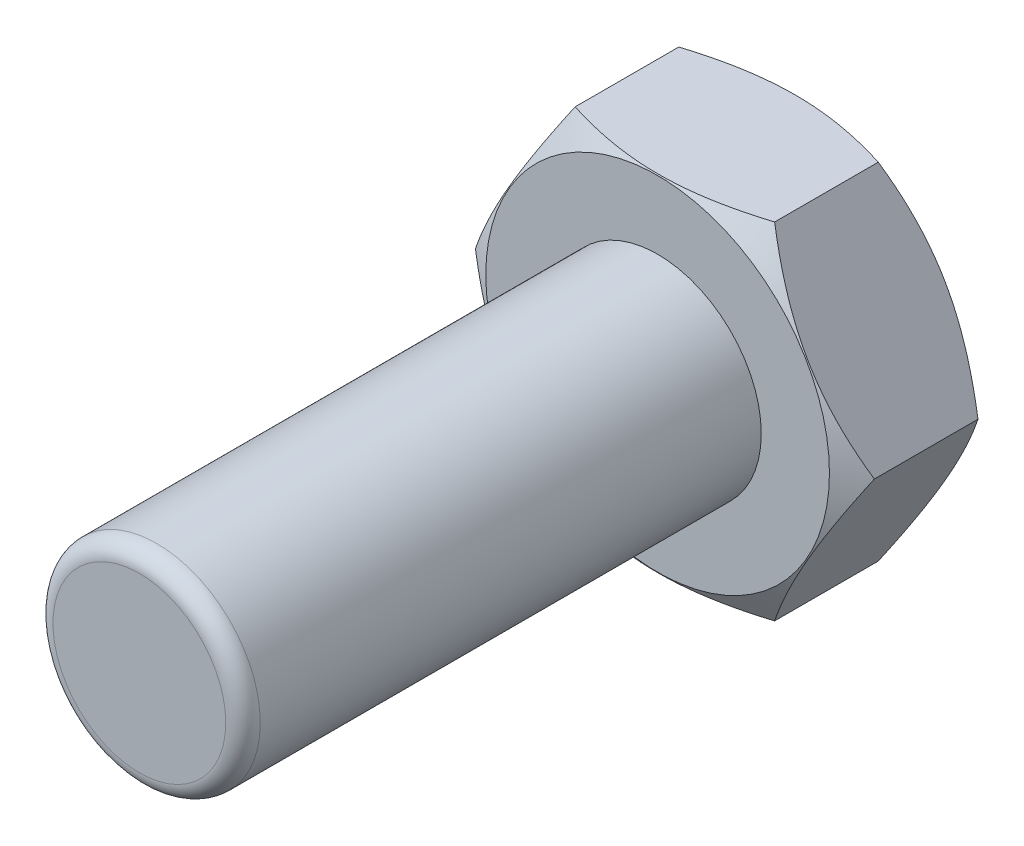
ISO-10303-21;
HEADER;
FILE_DESCRIPTION(('STEP AP214'),'2;1');
FILE_NAME('part.step','',(''),(''),'','','');
FILE_SCHEMA(('AUTOMOTIVE_DESIGN { 1 0 10303 214 1 1 1 1 }'));
ENDSEC;
DATA;
#1=APPLICATION_CONTEXT('core data for automotive mechanical design processes');
#2=APPLICATION_PROTOCOL_DEFINITION('international standard','automotive_design',2000,#1);
#3=PRODUCT_CONTEXT('',#1,'mechanical');
#4=PRODUCT('Part','Part','',(#3));
#5=PRODUCT_RELATED_PRODUCT_CATEGORY('part','',(#4));
#6=PRODUCT_DEFINITION_FORMATION('','',#4);
#7=PRODUCT_DEFINITION_CONTEXT('part definition',#1,'design');
#8=PRODUCT_DEFINITION('design','',#6,#7);
#9=PRODUCT_DEFINITION_SHAPE('','',#8);
#10=(LENGTH_UNIT() NAMED_UNIT(*) SI_UNIT(.MILLI.,.METRE.));
#11=(NAMED_UNIT(*) PLANE_ANGLE_UNIT() SI_UNIT($,.RADIAN.));
#12=(NAMED_UNIT(*) SI_UNIT($,.STERADIAN.) SOLID_ANGLE_UNIT());
#13=UNCERTAINTY_MEASURE_WITH_UNIT(LENGTH_MEASURE(1.E-05),#10,'distance_accuracy_value','');
#14=(GEOMETRIC_REPRESENTATION_CONTEXT(3) GLOBAL_UNCERTAINTY_ASSIGNED_CONTEXT((#13)) GLOBAL_UNIT_ASSIGNED_CONTEXT((#10,
#11,#12)) REPRESENTATION_CONTEXT('',''));
#15=CARTESIAN_POINT('',(0.,0.,0.));
#16=DIRECTION('',(0.,0.,1.));
#17=DIRECTION('',(1.,0.,0.));
#18=AXIS2_PLACEMENT_3D('',#15,#16,#17);
#19=CARTESIAN_POINT('',(0.,0.,4.));
#20=DIRECTION('',(0.,0.,1.));
#21=DIRECTION('',(1.,0.,0.));
#22=AXIS2_PLACEMENT_3D('',#19,#20,#21);
#23=PLANE('',#22);
#24=CARTESIAN_POINT('',(0.,0.,4.));
#25=DIRECTION('',(0.,0.,1.));
#26=DIRECTION('',(1.,0.,0.));
#27=AXIS2_PLACEMENT_3D('',#24,#25,#26);
#28=CIRCLE('',#27,3.);
#29=CARTESIAN_POINT('',(3.,0.,4.));
#30=VERTEX_POINT('',#29);
#31=EDGE_CURVE('E123',#30,#30,#28,.T.);
#32=ORIENTED_EDGE('',*,*,#31,.F.);
#33=EDGE_LOOP('',(#32));
#34=FACE_BOUND('',#33,.T.);
#35=CARTESIAN_POINT('',(0.,0.,4.));
#36=DIRECTION('',(0.,0.,-1.));
#37=DIRECTION('',(-1.,0.,0.));
#38=AXIS2_PLACEMENT_3D('',#35,#36,#37);
#39=CIRCLE('',#38,4.97350269189624);
#40=CARTESIAN_POINT('',(-4.97350269189624,0.,4.));
#41=VERTEX_POINT('',#40);
#42=EDGE_CURVE('E262',#41,#41,#39,.T.);
#43=ORIENTED_EDGE('',*,*,#42,.F.);
#44=EDGE_LOOP('',(#43));
#45=FACE_BOUND('',#44,.T.);
#46=ADVANCED_FACE('F38',(#34,#45),#23,.T.);
#47=CARTESIAN_POINT('',(0.,0.,19.));
#48=DIRECTION('',(0.,0.,-1.));
#49=DIRECTION('',(-1.,0.,0.));
#50=AXIS2_PLACEMENT_3D('',#47,#48,#49);
#51=CYLINDRICAL_SURFACE('',#50,3.);
#52=CARTESIAN_POINT('',(0.,0.,18.5));
#53=DIRECTION('',(0.,0.,1.));
#54=DIRECTION('',(1.,0.,0.));
#55=AXIS2_PLACEMENT_3D('',#52,#53,#54);
#56=CIRCLE('',#55,3.);
#57=CARTESIAN_POINT('',(3.,0.,18.5));
#58=VERTEX_POINT('',#57);
#59=EDGE_CURVE('E11',#58,#58,#56,.F.);
#60=ORIENTED_EDGE('',*,*,#59,.T.);
#61=EDGE_LOOP('',(#60));
#62=FACE_BOUND('',#61,.T.);
#63=ORIENTED_EDGE('',*,*,#31,.T.);
#64=EDGE_LOOP('',(#63));
#65=FACE_BOUND('',#64,.T.);
#66=ADVANCED_FACE('F241',(#62,#65),#51,.T.);
#67=CARTESIAN_POINT('',(0.,0.,19.));
#68=DIRECTION('',(0.,0.,1.));
#69=DIRECTION('',(1.,0.,0.));
#70=AXIS2_PLACEMENT_3D('',#67,#68,#69);
#71=PLANE('',#70);
#72=CARTESIAN_POINT('',(0.,0.,19.));
#73=DIRECTION('',(0.,0.,1.));
#74=DIRECTION('',(1.,0.,0.));
#75=AXIS2_PLACEMENT_3D('',#72,#73,#74);
#76=CIRCLE('',#75,2.5);
#77=CARTESIAN_POINT('',(2.5,0.,19.));
#78=VERTEX_POINT('',#77);
#79=EDGE_CURVE('E46',#78,#78,#76,.T.);
#80=ORIENTED_EDGE('',*,*,#79,.T.);
#81=EDGE_LOOP('',(#80));
#82=FACE_BOUND('',#81,.T.);
#83=ADVANCED_FACE('F171',(#82),#71,.T.);
#84=CARTESIAN_POINT('',(0.,0.,4.));
#85=DIRECTION('',(0.,0.,-1.));
#86=DIRECTION('',(-1.,0.,0.));
#87=AXIS2_PLACEMENT_3D('',#84,#85,#86);
#88=CONICAL_SURFACE('',#87,4.97350269189624,1.01219701145133);
#89=ORIENTED_EDGE('',*,*,#42,.T.);
#90=EDGE_LOOP('',(#89));
#91=FACE_BOUND('',#90,.T.);
#92=CARTESIAN_POINT('',(2.88663587589427,5.00019999999999,3.49992782905133));
#93=CARTESIAN_POINT('',(3.0144081835103,4.7788918714087,3.57983069288711));
#94=CARTESIAN_POINT('',(3.14350838469545,4.55528376368866,3.65255832475134));
#95=CARTESIAN_POINT('',(3.40434625922798,4.10349931246005,3.77942971021988));
#96=CARTESIAN_POINT('',(3.53609053308566,3.87531153653228,3.83351858029309));
#97=CARTESIAN_POINT('',(3.73320124266502,3.53390577282486,3.89654033518077));
#98=CARTESIAN_POINT('',(3.79785381691389,3.42192422938571,3.91438943130841));
#99=CARTESIAN_POINT('',(3.92749478060731,3.19737949352652,3.94417152378572));
#100=CARTESIAN_POINT('',(3.99248313360476,3.0848163642347,3.95610514914306));
#101=CARTESIAN_POINT('',(4.12258249153657,2.85947766626473,3.97372919788761));
#102=CARTESIAN_POINT('',(4.18769319857348,2.74670261356006,3.97942831403867));
#103=CARTESIAN_POINT('',(4.31797052637158,2.52105566273945,3.98446349373414));
#104=CARTESIAN_POINT('',(4.38313714480818,2.40818376864981,3.98379981011161));
#105=CARTESIAN_POINT('',(4.55935821128478,2.10295992814836,3.97338846903841));
#106=CARTESIAN_POINT('',(4.67033513399221,1.91074225955146,3.95755957629237));
#107=CARTESIAN_POINT('',(4.89141814185482,1.52781525724327,3.90854363890215));
#108=CARTESIAN_POINT('',(5.00152313552287,1.33710781404316,3.87533753057274));
#109=CARTESIAN_POINT('',(5.22309732022138,0.953330068499685,3.79277731005549));
#110=CARTESIAN_POINT('',(5.33452908874937,0.760324583831949,3.74303093759897));
#111=CARTESIAN_POINT('',(5.55547623077943,0.377632908048745,3.63053514487105));
#112=CARTESIAN_POINT('',(5.66499546394717,0.187940031796243,3.56781628624835));
#113=CARTESIAN_POINT('',(5.77361816195008,-0.000200000000000483,3.49992782905133));
#114=B_SPLINE_CURVE_WITH_KNOTS('',3,(#92,#93,#94,#95,#96,#97,#98,#99,#100,#101,#102,#103,#104,
#105,#106,#107,#108,#109,#110,#111,#112,#113),.UNSPECIFIED.,.F.,.F.,(4,2,2,2,2,2,2,2,2,2,4),(0.,
0.803762628060273,1.60987217964057,2.00134092758941,2.39276804069575,2.78364868938504,
3.17451380605366,3.84126989592928,4.50875898916442,5.19336506568141,5.87637629561687),.UNSPECIFIED.);
#115=CARTESIAN_POINT('',(2.8867513459481,4.99999999999999,3.5));
#116=VERTEX_POINT('',#115);
#117=CARTESIAN_POINT('',(5.77350269189623,0.,3.5));
#118=VERTEX_POINT('',#117);
#119=EDGE_CURVE('E143',#116,#118,#114,.T.);
#120=ORIENTED_EDGE('',*,*,#119,.F.);
#121=CARTESIAN_POINT('',(-8.68206422951937,4.99999999999995,0.846630360625103));
#122=CARTESIAN_POINT('',(-8.48984229753325,4.99999999999995,0.950725897578673));
#123=CARTESIAN_POINT('',(-8.29726786175632,4.99999999999995,1.0541762232573));
#124=CARTESIAN_POINT('',(-7.91127347550846,4.99999999999995,1.2594985898648));
#125=CARTESIAN_POINT('',(-7.71785350307147,4.99999999999995,1.36137058947439));
#126=CARTESIAN_POINT('',(-7.32973420920898,4.99999999999995,1.56340088051147));
#127=CARTESIAN_POINT('',(-7.13503335969796,4.99999999999996,1.66355624158371));
#128=CARTESIAN_POINT('',(-6.74447923577921,4.99999999999996,1.86160384231195));
#129=CARTESIAN_POINT('',(-6.5486259471362,4.99999999999996,1.95949605393892));
#130=CARTESIAN_POINT('',(-6.14647659846491,4.99999999999996,2.15699563488297));
#131=CARTESIAN_POINT('',(-5.94011649098891,4.99999999999996,2.25647294387211));
#132=CARTESIAN_POINT('',(-5.52564207752674,4.99999999999996,2.4517001259967));
#133=CARTESIAN_POINT('',(-5.31752781829278,4.99999999999996,2.54745009809459));
#134=CARTESIAN_POINT('',(-4.8993416476217,4.99999999999996,2.73423578293052));
#135=CARTESIAN_POINT('',(-4.68927105681938,4.99999999999996,2.82527443739985));
#136=CARTESIAN_POINT('',(-4.26662661952908,4.99999999999997,3.00150319452745));
#137=CARTESIAN_POINT('',(-4.05405221733987,4.99999999999997,3.08669196906337));
#138=CARTESIAN_POINT('',(-3.57313414137315,4.99999999999997,3.26977874676671));
#139=CARTESIAN_POINT('',(-3.30399297837286,4.99999999999997,3.36561353706304));
#140=CARTESIAN_POINT('',(-2.76071897534502,4.99999999999997,3.54168391872462));
#141=CARTESIAN_POINT('',(-2.48658850076106,4.99999999999997,3.621926701917));
#142=CARTESIAN_POINT('',(-1.93783397042628,4.99999999999997,3.76054063429165));
#143=CARTESIAN_POINT('',(-1.66330459966291,4.99999999999997,3.81927389577142));
#144=CARTESIAN_POINT('',(-1.24842593126026,4.99999999999998,3.88858112005756));
#145=CARTESIAN_POINT('',(-1.10962341220006,4.99999999999998,3.90855107983615));
#146=CARTESIAN_POINT('',(-0.831217777316716,4.99999999999998,3.94170090588461));
#147=CARTESIAN_POINT('',(-0.691614784314206,4.99999999999998,3.95488178706191));
#148=CARTESIAN_POINT('',(-0.409902306306351,4.99999999999998,3.97419415083215));
#149=CARTESIAN_POINT('',(-0.267785630771065,4.99999999999998,3.98022161089371));
#150=CARTESIAN_POINT('',(0.0165671641632159,4.99999999999998,3.9846848551111));
#151=CARTESIAN_POINT('',(0.158803282987711,4.99999999999998,3.98312067557459));
#152=CARTESIAN_POINT('',(0.443007126762287,4.99999999999998,3.97244992582317));
#153=CARTESIAN_POINT('',(0.58497482019436,4.99999999999998,3.96334251908101));
#154=CARTESIAN_POINT('',(0.868248164811896,4.99999999999998,3.93788511467705));
#155=CARTESIAN_POINT('',(1.00955380329959,4.99999999999998,3.9215349786746));
#156=CARTESIAN_POINT('',(1.43732445023268,4.99999999999998,3.86157271584852));
#157=CARTESIAN_POINT('',(1.7223245467396,4.99999999999999,3.80727410899935));
#158=CARTESIAN_POINT('',(2.28693891359288,4.99999999999999,3.67599588211175));
#159=CARTESIAN_POINT('',(2.56655131572721,4.99999999999999,3.59900854022744));
#160=CARTESIAN_POINT('',(3.10615883441635,4.99999999999999,3.43228623018333));
#161=CARTESIAN_POINT('',(3.36642379658689,4.99999999999999,3.34340933943089));
#162=CARTESIAN_POINT('',(3.88271763716099,4.99999999999999,3.15402190339427));
#163=CARTESIAN_POINT('',(4.13874526181271,4.99999999999999,3.05350798285101));
#164=CARTESIAN_POINT('',(4.64756504944393,4.99999999999999,2.84360736898123));
#165=CARTESIAN_POINT('',(4.90035165009457,5.,2.73420730846554));
#166=CARTESIAN_POINT('',(5.40291352612095,5.,2.50880985415489));
#167=CARTESIAN_POINT('',(5.65268914184197,5.,2.39281321463871));
#168=CARTESIAN_POINT('',(6.13691988050154,5.,2.16190457091514));
#169=CARTESIAN_POINT('',(6.37149758908357,5.,2.0472484653541));
#170=CARTESIAN_POINT('',(6.83886979381445,5.,1.81434353837331));
#171=CARTESIAN_POINT('',(7.07166421804625,5.,1.69609457300439));
#172=CARTESIAN_POINT('',(7.53476239036371,5.,1.4572651537092));
#173=CARTESIAN_POINT('',(7.76507257776218,5.,1.33669715181897));
#174=CARTESIAN_POINT('',(8.22444085723042,5.00000000000001,1.09326215557268));
#175=CARTESIAN_POINT('',(8.45349909442034,5.00000000000001,0.970395435303213));
#176=CARTESIAN_POINT('',(8.68206422951934,5.00000000000001,0.846630360625105));
#177=B_SPLINE_CURVE_WITH_KNOTS('',3,(#121,#122,#123,#124,#125,#126,#127,#128,#129,#130,#131,
#132,#133,#134,#135,#136,#137,#138,#139,#140,#141,#142,#143,#144,#145,#146,#147,#148,#149,#150,
#151,#152,#153,#154,#155,#156,#157,#158,#159,#160,#161,#162,#163,#164,#165,#166,#167,#168,#169,
#170,#171,#172,#173,#174,#175,#176),.UNSPECIFIED.,.F.,.F.,(4,2,2,2,2,2,2,2,2,2,2,2,2,2,2,2,2,2,
2,2,2,2,2,2,2,2,2,4),(0.,0.655797273333695,1.31161168599699,1.96845209151456,2.62530062762448,
3.31252740730558,3.99973592835045,4.68651004919488,5.37343957919089,6.23016015262012,
7.08648461997409,7.92764658090529,8.34820075809759,8.76869204788465,9.19522584633634,
9.62175760485622,10.0483366711417,10.4749238857053,11.3439958649751,12.213363964989,
13.0380696070739,13.8630150527807,14.6892252790543,15.5153412224169,16.2986012444029,
17.081892689463,17.8617599306687,18.6415347700269),.UNSPECIFIED.);
#178=CARTESIAN_POINT('',(-2.88675134594814,4.99999999999997,3.5));
#179=VERTEX_POINT('',#178);
#180=EDGE_CURVE('E146',#179,#116,#177,.T.);
#181=ORIENTED_EDGE('',*,*,#180,.F.);
#182=CARTESIAN_POINT('',(-5.77361816195007,-0.000200000000040316,3.49992782905133));
#183=CARTESIAN_POINT('',(-5.64584585433404,0.22110812859125,3.57983069288711));
#184=CARTESIAN_POINT('',(-5.5167456531489,0.444716236311288,3.65255832475134));
#185=CARTESIAN_POINT('',(-5.25590777861637,0.896500687539905,3.77942971021988));
#186=CARTESIAN_POINT('',(-5.12416350475869,1.12468846346767,3.83351858029309));
#187=CARTESIAN_POINT('',(-4.92705279517933,1.46609422717509,3.89654033518077));
#188=CARTESIAN_POINT('',(-4.86240022093047,1.57807577061424,3.9143894313084));
#189=CARTESIAN_POINT('',(-4.73275925723705,1.80262050647344,3.94417152378571));
#190=CARTESIAN_POINT('',(-4.66777090423959,1.91518363576525,3.95610514914306));
#191=CARTESIAN_POINT('',(-4.53767154630779,2.14052233373523,3.97372919788761));
#192=CARTESIAN_POINT('',(-4.47256083927088,2.25329738643989,3.97942831403866));
#193=CARTESIAN_POINT('',(-4.34228351147278,2.47894433726051,3.98446349373414));
#194=CARTESIAN_POINT('',(-4.27711689303618,2.59181623135015,3.98379981011161));
#195=CARTESIAN_POINT('',(-4.10089582655958,2.8970400718516,3.97338846903841));
#196=CARTESIAN_POINT('',(-3.98991890385216,3.0892577404485,3.95755957629237));
#197=CARTESIAN_POINT('',(-3.76883589598955,3.4721847427567,3.90854363890215));
#198=CARTESIAN_POINT('',(-3.6587309023215,3.66289218595681,3.87533753057274));
#199=CARTESIAN_POINT('',(-3.43715671762299,4.04666993150028,3.79277731005549));
#200=CARTESIAN_POINT('',(-3.325724949095,4.23967541616802,3.74303093759897));
#201=CARTESIAN_POINT('',(-3.10477780706494,4.62236709195122,3.63053514487105));
#202=CARTESIAN_POINT('',(-2.99525857389721,4.81205996820372,3.56781628624835));
#203=CARTESIAN_POINT('',(-2.8866358758943,5.00019999999997,3.49992782905133));
#204=B_SPLINE_CURVE_WITH_KNOTS('',3,(#182,#183,#184,#185,#186,#187,#188,#189,#190,#191,#192,
#193,#194,#195,#196,#197,#198,#199,#200,#201,#202,#203),.UNSPECIFIED.,.F.,.F.,(4,2,2,2,2,2,2,2,
2,2,4),(0.,0.803762628060273,1.60987217964057,2.0013409275894,2.39276804069575,2.78364868938504,
3.17451380605366,3.84126989592928,4.50875898916442,5.19336506568141,5.87637629561687),.UNSPECIFIED.);
#205=CARTESIAN_POINT('',(-5.77350269189624,0.,3.5));
#206=VERTEX_POINT('',#205);
#207=EDGE_CURVE('E150',#206,#179,#204,.T.);
#208=ORIENTED_EDGE('',*,*,#207,.F.);
#209=CARTESIAN_POINT('',(-2.88663587589423,-5.00020000000001,3.49992782905133));
#210=CARTESIAN_POINT('',(-3.01440818351027,-4.77889187140872,3.57983069288711));
#211=CARTESIAN_POINT('',(-3.14350838469542,-4.55528376368868,3.65255832475134));
#212=CARTESIAN_POINT('',(-3.40434625922795,-4.10349931246007,3.77942971021988));
#213=CARTESIAN_POINT('',(-3.53609053308563,-3.87531153653231,3.83351858029309));
#214=CARTESIAN_POINT('',(-3.733201242665,-3.53390577282489,3.89654033518077));
#215=CARTESIAN_POINT('',(-3.79785381691386,-3.42192422938574,3.9143894313084));
#216=CARTESIAN_POINT('',(-3.92749478060728,-3.19737949352655,3.94417152378571));
#217=CARTESIAN_POINT('',(-3.99248313360474,-3.08481636423473,3.95610514914306));
#218=CARTESIAN_POINT('',(-4.12258249153655,-2.85947766626476,3.97372919788761));
#219=CARTESIAN_POINT('',(-4.18769319857346,-2.74670261356009,3.97942831403866));
#220=CARTESIAN_POINT('',(-4.31797052637156,-2.52105566273948,3.98446349373414));
#221=CARTESIAN_POINT('',(-4.38313714480816,-2.40818376864984,3.98379981011161));
#222=CARTESIAN_POINT('',(-4.55935821128477,-2.10295992814839,3.97338846903841));
#223=CARTESIAN_POINT('',(-4.67033513399219,-1.91074225955149,3.95755957629237));
#224=CARTESIAN_POINT('',(-4.89141814185481,-1.5278152572433,3.90854363890215));
#225=CARTESIAN_POINT('',(-5.00152313552286,-1.33710781404319,3.87533753057274));
#226=CARTESIAN_POINT('',(-5.22309732022137,-0.953330068499722,3.79277731005549));
#227=CARTESIAN_POINT('',(-5.33452908874936,-0.760324583831987,3.74303093759897));
#228=CARTESIAN_POINT('',(-5.55547623077943,-0.377632908048784,3.63053514487105));
#229=CARTESIAN_POINT('',(-5.66499546394717,-0.187940031796282,3.56781628624835));
#230=CARTESIAN_POINT('',(-5.77361816195007,0.000199999999959787,3.49992782905133));
#231=B_SPLINE_CURVE_WITH_KNOTS('',3,(#209,#210,#211,#212,#213,#214,#215,#216,#217,#218,#219,
#220,#221,#222,#223,#224,#225,#226,#227,#228,#229,#230),.UNSPECIFIED.,.F.,.F.,(4,2,2,2,2,2,2,2,
2,2,4),(0.,0.803762628060272,1.60987217964057,2.0013409275894,2.39276804069575,2.78364868938504,
3.17451380605366,3.84126989592928,4.50875898916442,5.19336506568141,5.87637629561687),.UNSPECIFIED.);
#232=CARTESIAN_POINT('',(-2.88675134594807,-5.00000000000001,3.5));
#233=VERTEX_POINT('',#232);
#234=EDGE_CURVE('E53',#233,#206,#231,.T.);
#235=ORIENTED_EDGE('',*,*,#234,.F.);
#236=CARTESIAN_POINT('',(8.6820642295194,-4.99999999999989,0.846630360625105));
#237=CARTESIAN_POINT('',(8.48984229753328,-4.99999999999989,0.950725897578674));
#238=CARTESIAN_POINT('',(8.29726786175635,-4.99999999999989,1.0541762232573));
#239=CARTESIAN_POINT('',(7.9112734755085,-4.9999999999999,1.2594985898648));
#240=CARTESIAN_POINT('',(7.71785350307151,-4.9999999999999,1.36137058947439));
#241=CARTESIAN_POINT('',(7.32973420920902,-4.9999999999999,1.56340088051147));
#242=CARTESIAN_POINT('',(7.135033359698,-4.9999999999999,1.66355624158371));
#243=CARTESIAN_POINT('',(6.74447923577925,-4.99999999999991,1.86160384231195));
#244=CARTESIAN_POINT('',(6.54862594713624,-4.99999999999991,1.95949605393892));
#245=CARTESIAN_POINT('',(6.14647659846495,-4.99999999999991,2.15699563488297));
#246=CARTESIAN_POINT('',(5.94011649098895,-4.99999999999992,2.25647294387211));
#247=CARTESIAN_POINT('',(5.52564207752677,-4.99999999999992,2.4517001259967));
#248=CARTESIAN_POINT('',(5.31752781829282,-4.99999999999992,2.5474500980946));
#249=CARTESIAN_POINT('',(4.89934164762174,-4.99999999999993,2.73423578293052));
#250=CARTESIAN_POINT('',(4.68927105681942,-4.99999999999993,2.82527443739985));
#251=CARTESIAN_POINT('',(4.26662661952912,-4.99999999999993,3.00150319452745));
#252=CARTESIAN_POINT('',(4.05405221733991,-4.99999999999994,3.08669196906338));
#253=CARTESIAN_POINT('',(3.57313414137319,-4.99999999999994,3.26977874676671));
#254=CARTESIAN_POINT('',(3.30399297837289,-4.99999999999994,3.36561353706304));
#255=CARTESIAN_POINT('',(2.76071897534506,-4.99999999999995,3.54168391872462));
#256=CARTESIAN_POINT('',(2.4865885007611,-4.99999999999995,3.621926701917));
#257=CARTESIAN_POINT('',(1.93783397042631,-4.99999999999996,3.76054063429165));
#258=CARTESIAN_POINT('',(1.66330459966295,-4.99999999999996,3.81927389577143));
#259=CARTESIAN_POINT('',(1.2484259312603,-4.99999999999997,3.88858112005756));
#260=CARTESIAN_POINT('',(1.1096234122001,-4.99999999999997,3.90855107983615));
#261=CARTESIAN_POINT('',(0.831217777316753,-4.99999999999997,3.94170090588461));
#262=CARTESIAN_POINT('',(0.691614784314243,-4.99999999999997,3.95488178706191));
#263=CARTESIAN_POINT('',(0.409902306306388,-4.99999999999997,3.97419415083215));
#264=CARTESIAN_POINT('',(0.267785630771101,-4.99999999999998,3.98022161089371));
#265=CARTESIAN_POINT('',(-0.0165671641631801,-4.99999999999998,3.9846848551111));
#266=CARTESIAN_POINT('',(-0.158803282987675,-4.99999999999998,3.98312067557459));
#267=CARTESIAN_POINT('',(-0.443007126762251,-4.99999999999998,3.97244992582318));
#268=CARTESIAN_POINT('',(-0.584974820194325,-4.99999999999998,3.96334251908101));
#269=CARTESIAN_POINT('',(-0.868248164811861,-4.99999999999999,3.93788511467705));
#270=CARTESIAN_POINT('',(-1.00955380329956,-4.99999999999999,3.9215349786746));
#271=CARTESIAN_POINT('',(-1.43732445023265,-4.99999999999999,3.86157271584852));
#272=CARTESIAN_POINT('',(-1.72232454673956,-5.,3.80727410899935));
#273=CARTESIAN_POINT('',(-2.28693891359285,-5.,3.67599588211175));
#274=CARTESIAN_POINT('',(-2.56655131572717,-5.00000000000001,3.59900854022744));
#275=CARTESIAN_POINT('',(-3.10615883441631,-5.00000000000001,3.43228623018333));
#276=CARTESIAN_POINT('',(-3.36642379658686,-5.00000000000001,3.34340933943089));
#277=CARTESIAN_POINT('',(-3.88271763716095,-5.00000000000002,3.15402190339427));
#278=CARTESIAN_POINT('',(-4.13874526181267,-5.00000000000002,3.05350798285101));
#279=CARTESIAN_POINT('',(-4.64756504944389,-5.00000000000003,2.84360736898123));
#280=CARTESIAN_POINT('',(-4.90035165009453,-5.00000000000003,2.73420730846554));
#281=CARTESIAN_POINT('',(-5.40291352612091,-5.00000000000003,2.50880985415489));
#282=CARTESIAN_POINT('',(-5.65268914184193,-5.00000000000004,2.39281321463871));
#283=CARTESIAN_POINT('',(-6.1369198805015,-5.00000000000004,2.16190457091514));
#284=CARTESIAN_POINT('',(-6.37149758908354,-5.00000000000005,2.0472484653541));
#285=CARTESIAN_POINT('',(-6.83886979381441,-5.00000000000005,1.81434353837331));
#286=CARTESIAN_POINT('',(-7.07166421804621,-5.00000000000005,1.69609457300439));
#287=CARTESIAN_POINT('',(-7.53476239036367,-5.00000000000006,1.45726515370919));
#288=CARTESIAN_POINT('',(-7.76507257776214,-5.00000000000006,1.33669715181896));
#289=CARTESIAN_POINT('',(-8.22444085723039,-5.00000000000006,1.09326215557268));
#290=CARTESIAN_POINT('',(-8.45349909442031,-5.00000000000007,0.970395435303211));
#291=CARTESIAN_POINT('',(-8.6820642295193,-5.00000000000007,0.846630360625102));
#292=B_SPLINE_CURVE_WITH_KNOTS('',3,(#236,#237,#238,#239,#240,#241,#242,#243,#244,#245,#246,
#247,#248,#249,#250,#251,#252,#253,#254,#255,#256,#257,#258,#259,#260,#261,#262,#263,#264,#265,
#266,#267,#268,#269,#270,#271,#272,#273,#274,#275,#276,#277,#278,#279,#280,#281,#282,#283,#284,
#285,#286,#287,#288,#289,#290,#291),.UNSPECIFIED.,.F.,.F.,(4,2,2,2,2,2,2,2,2,2,2,2,2,2,2,2,2,2,
2,2,2,2,2,2,2,2,2,4),(0.,0.655797273333695,1.31161168599699,1.96845209151455,2.62530062762447,
3.31252740730558,3.99973592835045,4.68651004919487,5.37343957919089,6.23016015262012,
7.08648461997409,7.92764658090529,8.34820075809759,8.76869204788465,9.19522584633634,
9.62175760485622,10.0483366711417,10.4749238857053,11.3439958649751,12.213363964989,
13.0380696070739,13.8630150527807,14.6892252790543,15.5153412224169,16.2986012444029,
17.081892689463,17.8617599306687,18.6415347700269),.UNSPECIFIED.);
#293=CARTESIAN_POINT('',(2.88675134594817,-4.99999999999995,3.5));
#294=VERTEX_POINT('',#293);
#295=EDGE_CURVE('E178',#294,#233,#292,.T.);
#296=ORIENTED_EDGE('',*,*,#295,.F.);
#297=CARTESIAN_POINT('',(5.77361816195007,0.0002,3.49992782905133));
#298=CARTESIAN_POINT('',(5.64584585433404,-0.221108128591291,3.57983069288711));
#299=CARTESIAN_POINT('',(5.5167456531489,-0.444716236311329,3.65255832475134));
#300=CARTESIAN_POINT('',(5.25590777861637,-0.896500687539947,3.77942971021988));
#301=CARTESIAN_POINT('',(5.12416350475869,-1.12468846346771,3.83351858029309));
#302=CARTESIAN_POINT('',(4.92705279517933,-1.46609422717513,3.89654033518076));
#303=CARTESIAN_POINT('',(4.86240022093047,-1.57807577061428,3.9143894313084));
#304=CARTESIAN_POINT('',(4.73275925723705,-1.80262050647348,3.94417152378571));
#305=CARTESIAN_POINT('',(4.66777090423959,-1.91518363576529,3.95610514914305));
#306=CARTESIAN_POINT('',(4.53767154630779,-2.14052233373527,3.97372919788761));
#307=CARTESIAN_POINT('',(4.47256083927088,-2.25329738643994,3.97942831403866));
#308=CARTESIAN_POINT('',(4.34228351147278,-2.47894433726055,3.98446349373413));
#309=CARTESIAN_POINT('',(4.27711689303618,-2.59181623135019,3.9837998101116));
#310=CARTESIAN_POINT('',(4.10089582655958,-2.89704007185163,3.9733884690384));
#311=CARTESIAN_POINT('',(3.98991890385216,-3.08925774044854,3.95755957629236));
#312=CARTESIAN_POINT('',(3.76883589598956,-3.47218474275672,3.90854363890213));
#313=CARTESIAN_POINT('',(3.65873090232152,-3.66289218595682,3.87533753057273));
#314=CARTESIAN_POINT('',(3.43715671762301,-4.04666993150028,3.79277731005548));
#315=CARTESIAN_POINT('',(3.32572494909503,-4.23967541616802,3.74303093759896));
#316=CARTESIAN_POINT('',(3.10477780706497,-4.62236709195121,3.63053514487104));
#317=CARTESIAN_POINT('',(2.99525857389724,-4.81205996820371,3.56781628624835));
#318=CARTESIAN_POINT('',(2.88663587589434,-5.00019999999995,3.49992782905133));
#319=B_SPLINE_CURVE_WITH_KNOTS('',3,(#297,#298,#299,#300,#301,#302,#303,#304,#305,#306,#307,
#308,#309,#310,#311,#312,#313,#314,#315,#316,#317,#318),.UNSPECIFIED.,.F.,.F.,(4,2,2,2,2,2,2,2,
2,2,4),(0.,0.803762628060273,1.60987217964057,2.0013409275894,2.39276804069575,2.78364868938504,
3.17451380605366,3.84126989592926,4.50875898916438,5.19336506568135,5.87637629561679),.UNSPECIFIED.);
#320=EDGE_CURVE('E132',#118,#294,#319,.T.);
#321=ORIENTED_EDGE('',*,*,#320,.F.);
#322=EDGE_LOOP('',(#120,#181,#208,#235,#296,#321));
#323=FACE_BOUND('',#322,.T.);
#324=ADVANCED_FACE('F165',(#91,#323),#88,.T.);
#325=CARTESIAN_POINT('',(-2.88675134594807,-5.00000000000001,4.));
#326=DIRECTION('',(0.,1.,0.));
#327=DIRECTION('',(-1.,0.,0.));
#328=AXIS2_PLACEMENT_3D('',#325,#326,#327);
#329=PLANE('',#328);
#330=DIRECTION('',(0.,0.,-1.));
#331=VECTOR('',#330,1.);
#332=CARTESIAN_POINT('',(-2.88675134594807,-5.00000000000001,4.));
#333=LINE('',#332,#331);
#334=CARTESIAN_POINT('',(-2.88675134594807,-5.00000000000001,0.500000000000001));
#335=VERTEX_POINT('',#334);
#336=EDGE_CURVE('E111',#233,#335,#333,.T.);
#337=ORIENTED_EDGE('',*,*,#336,.T.);
#338=CARTESIAN_POINT('',(-8.6820642295193,-5.00000000000007,3.1533696393749));
#339=CARTESIAN_POINT('',(-8.48984229753318,-5.00000000000007,3.04927410242133));
#340=CARTESIAN_POINT('',(-8.29726786175625,-5.00000000000006,2.94582377674271));
#341=CARTESIAN_POINT('',(-7.9112734755084,-5.00000000000006,2.7405014101352));
#342=CARTESIAN_POINT('',(-7.71785350307141,-5.00000000000006,2.63862941052562));
#343=CARTESIAN_POINT('',(-7.32973420920891,-5.00000000000006,2.43659911948853));
#344=CARTESIAN_POINT('',(-7.1350333596979,-5.00000000000005,2.3364437584163));
#345=CARTESIAN_POINT('',(-6.74447923577915,-5.00000000000005,2.13839615768806));
#346=CARTESIAN_POINT('',(-6.54862594713614,-5.00000000000005,2.04050394606109));
#347=CARTESIAN_POINT('',(-6.14647659846484,-5.00000000000004,1.84300436511704));
#348=CARTESIAN_POINT('',(-5.94011649098884,-5.00000000000004,1.74352705612789));
#349=CARTESIAN_POINT('',(-5.52564207752667,-5.00000000000004,1.5482998740033));
#350=CARTESIAN_POINT('',(-5.31752781829272,-5.00000000000003,1.45254990190541));
#351=CARTESIAN_POINT('',(-4.89934164762164,-5.00000000000003,1.26576421706949));
#352=CARTESIAN_POINT('',(-4.68927105681932,-5.00000000000003,1.17472556260016));
#353=CARTESIAN_POINT('',(-4.26662661952902,-5.00000000000002,0.998496805472554));
#354=CARTESIAN_POINT('',(-4.05405221733981,-5.00000000000002,0.91330803093663));
#355=CARTESIAN_POINT('',(-3.57313414137309,-5.00000000000002,0.730221253233296));
#356=CARTESIAN_POINT('',(-3.3039929783728,-5.00000000000001,0.634386462936967));
#357=CARTESIAN_POINT('',(-2.76071897534496,-5.00000000000001,0.458316081275384));
#358=CARTESIAN_POINT('',(-2.486588500761,-5.,0.378073298083004));
#359=CARTESIAN_POINT('',(-1.93783397042622,-5.,0.23945936570835));
#360=CARTESIAN_POINT('',(-1.66330459966286,-5.,0.180726104228577));
#361=CARTESIAN_POINT('',(-1.2484259312602,-4.99999999999999,0.111418879942445));
#362=CARTESIAN_POINT('',(-1.1096234122,-4.99999999999999,0.0914489201638492));
#363=CARTESIAN_POINT('',(-0.831217777316658,-4.99999999999999,0.058299094115397));
#364=CARTESIAN_POINT('',(-0.691614784314148,-4.99999999999999,0.0451182129380898));
#365=CARTESIAN_POINT('',(-0.409902306306293,-4.99999999999998,0.025805849167851));
#366=CARTESIAN_POINT('',(-0.267785630771007,-4.99999999999998,0.0197783891062958));
#367=CARTESIAN_POINT('',(0.0165671641632749,-4.99999999999998,0.0153151448889054));
#368=CARTESIAN_POINT('',(0.15880328298777,-4.99999999999998,0.0168793244254143));
#369=CARTESIAN_POINT('',(0.443007126762346,-4.99999999999997,0.027550074176826));
#370=CARTESIAN_POINT('',(0.584974820194419,-4.99999999999997,0.0366574809189879));
#371=CARTESIAN_POINT('',(0.868248164811955,-4.99999999999997,0.0621148853229482));
#372=CARTESIAN_POINT('',(1.00955380329965,-4.99999999999997,0.0784650213254037));
#373=CARTESIAN_POINT('',(1.43732445023274,-4.99999999999996,0.138427284151481));
#374=CARTESIAN_POINT('',(1.72232454673965,-4.99999999999996,0.192725891000653));
#375=CARTESIAN_POINT('',(2.28693891359294,-4.99999999999995,0.324004117888247));
#376=CARTESIAN_POINT('',(2.56655131572726,-4.99999999999995,0.400991459772558));
#377=CARTESIAN_POINT('',(3.10615883441641,-4.99999999999995,0.567713769816669));
#378=CARTESIAN_POINT('',(3.36642379658695,-4.99999999999994,0.65659066056911));
#379=CARTESIAN_POINT('',(3.88271763716105,-4.99999999999994,0.845978096605729));
#380=CARTESIAN_POINT('',(4.13874526181277,-4.99999999999994,0.946492017148991));
#381=CARTESIAN_POINT('',(4.64756504944399,-4.99999999999993,1.15639263101877));
#382=CARTESIAN_POINT('',(4.90035165009463,-4.99999999999993,1.26579269153446));
#383=CARTESIAN_POINT('',(5.40291352612101,-4.99999999999992,1.49119014584511));
#384=CARTESIAN_POINT('',(5.65268914184203,-4.99999999999992,1.60718678536129));
#385=CARTESIAN_POINT('',(6.1369198805016,-4.99999999999991,1.83809542908486));
#386=CARTESIAN_POINT('',(6.37149758908364,-4.99999999999991,1.95275153464591));
#387=CARTESIAN_POINT('',(6.83886979381451,-4.99999999999991,2.18565646162669));
#388=CARTESIAN_POINT('',(7.07166421804631,-4.9999999999999,2.30390542699561));
#389=CARTESIAN_POINT('',(7.53476239036378,-4.9999999999999,2.54273484629081));
#390=CARTESIAN_POINT('',(7.76507257776225,-4.9999999999999,2.66330284818104));
#391=CARTESIAN_POINT('',(8.22444085723049,-4.99999999999989,2.90673784442733));
#392=CARTESIAN_POINT('',(8.45349909442041,-4.99999999999989,3.0296045646968));
#393=CARTESIAN_POINT('',(8.6820642295194,-4.99999999999989,3.1533696393749));
#394=B_SPLINE_CURVE_WITH_KNOTS('',3,(#338,#339,#340,#341,#342,#343,#344,#345,#346,#347,#348,
#349,#350,#351,#352,#353,#354,#355,#356,#357,#358,#359,#360,#361,#362,#363,#364,#365,#366,#367,
#368,#369,#370,#371,#372,#373,#374,#375,#376,#377,#378,#379,#380,#381,#382,#383,#384,#385,#386,
#387,#388,#389,#390,#391,#392,#393),.UNSPECIFIED.,.F.,.F.,(4,2,2,2,2,2,2,2,2,2,2,2,2,2,2,2,2,2,
2,2,2,2,2,2,2,2,2,4),(0.,0.655797273333692,1.31161168599699,1.96845209151456,2.62530062762447,
3.31252740730558,3.99973592835044,4.68651004919487,5.37343957919088,6.23016015262011,
7.08648461997408,7.92764658090528,8.34820075809758,8.76869204788464,9.19522584633633,
9.62175760485622,10.0483366711417,10.4749238857053,11.3439958649751,12.213363964989,
13.0380696070739,13.8630150527807,14.6892252790542,15.5153412224169,16.2986012444029,
17.081892689463,17.8617599306687,18.6415347700269),.UNSPECIFIED.);
#395=CARTESIAN_POINT('',(2.88675134594818,-4.99999999999995,0.500000000000002));
#396=VERTEX_POINT('',#395);
#397=EDGE_CURVE('E94',#335,#396,#394,.T.);
#398=ORIENTED_EDGE('',*,*,#397,.T.);
#399=DIRECTION('',(0.,0.,-1.));
#400=VECTOR('',#399,1.);
#401=CARTESIAN_POINT('',(2.88675134594818,-4.99999999999995,4.));
#402=LINE('',#401,#400);
#403=EDGE_CURVE('E115',#294,#396,#402,.T.);
#404=ORIENTED_EDGE('',*,*,#403,.F.);
#405=ORIENTED_EDGE('',*,*,#295,.T.);
#406=EDGE_LOOP('',(#337,#398,#404,#405));
#407=FACE_BOUND('',#406,.T.);
#408=ADVANCED_FACE('F170',(#407),#329,.F.);
#409=CARTESIAN_POINT('',(-5.77350269189624,0.,4.));
#410=DIRECTION('',(0.866025403784435,0.500000000000007,0.));
#411=DIRECTION('',(-0.500000000000007,0.866025403784435,0.));
#412=AXIS2_PLACEMENT_3D('',#409,#410,#411);
#413=PLANE('',#412);
#414=DIRECTION('',(0.,0.,-1.));
#415=VECTOR('',#414,1.);
#416=CARTESIAN_POINT('',(-5.77350269189624,0.,4.));
#417=LINE('',#416,#415);
#418=CARTESIAN_POINT('',(-5.77350269189624,0.,0.5));
#419=VERTEX_POINT('',#418);
#420=EDGE_CURVE('E105',#206,#419,#417,.T.);
#421=ORIENTED_EDGE('',*,*,#420,.T.);
#422=CARTESIAN_POINT('',(-5.77361816195007,0.00019999999995974,0.500072170948669));
#423=CARTESIAN_POINT('',(-5.64584585433404,-0.221108128591329,0.420169307112892));
#424=CARTESIAN_POINT('',(-5.51674565314889,-0.444716236311365,0.347441675248663));
#425=CARTESIAN_POINT('',(-5.25590777861636,-0.896500687539979,0.220570289780117));
#426=CARTESIAN_POINT('',(-5.12416350475868,-1.12468846346774,0.166481419706909));
#427=CARTESIAN_POINT('',(-4.92705279517931,-1.46609422717516,0.103459664819234));
#428=CARTESIAN_POINT('',(-4.86240022093044,-1.57807577061431,0.0856105686915958));
#429=CARTESIAN_POINT('',(-4.73275925723702,-1.8026205064735,0.055828476214286));
#430=CARTESIAN_POINT('',(-4.66777090423957,-1.91518363576532,0.0438948508569449));
#431=CARTESIAN_POINT('',(-4.53767154630776,-2.14052233373529,0.0262708021123857));
#432=CARTESIAN_POINT('',(-4.47256083927085,-2.25329738643996,0.0205716859613341));
#433=CARTESIAN_POINT('',(-4.34228351147274,-2.47894433726057,0.0155365062658603));
#434=CARTESIAN_POINT('',(-4.27711689303615,-2.59181623135021,0.0162001898883865));
#435=CARTESIAN_POINT('',(-4.10089582655954,-2.89704007185165,0.0266115309615915));
#436=CARTESIAN_POINT('',(-3.98991890385212,-3.08925774044856,0.042440423707629));
#437=CARTESIAN_POINT('',(-3.7688358959895,-3.47218474275675,0.0914563610978547));
#438=CARTESIAN_POINT('',(-3.65873090232145,-3.66289218595686,0.124662469427262));
#439=CARTESIAN_POINT('',(-3.43715671762294,-4.04666993150033,0.207222689944507));
#440=CARTESIAN_POINT('',(-3.32572494909495,-4.23967541616806,0.256969062401031));
#441=CARTESIAN_POINT('',(-3.10477780706488,-4.62236709195126,0.369464855128952));
#442=CARTESIAN_POINT('',(-2.99525857389714,-4.81205996820376,0.432183713751647));
#443=CARTESIAN_POINT('',(-2.88663587589423,-5.00020000000001,0.50007217094867));
#444=B_SPLINE_CURVE_WITH_KNOTS('',3,(#422,#423,#424,#425,#426,#427,#428,#429,#430,#431,#432,
#433,#434,#435,#436,#437,#438,#439,#440,#441,#442,#443),.UNSPECIFIED.,.F.,.F.,(4,2,2,2,2,2,2,2,
2,2,4),(0.,0.803762628060273,1.60987217964057,2.00134092758941,2.39276804069575,
2.78364868938504,3.17451380605366,3.84126989592928,4.50875898916441,5.19336506568141,
5.87637629561687),.UNSPECIFIED.);
#445=EDGE_CURVE('E89',#419,#335,#444,.T.);
#446=ORIENTED_EDGE('',*,*,#445,.T.);
#447=ORIENTED_EDGE('',*,*,#336,.F.);
#448=ORIENTED_EDGE('',*,*,#234,.T.);
#449=EDGE_LOOP('',(#421,#446,#447,#448));
#450=FACE_BOUND('',#449,.T.);
#451=ADVANCED_FACE('F110',(#450),#413,.F.);
#452=CARTESIAN_POINT('',(-2.88675134594814,4.99999999999997,4.));
#453=DIRECTION('',(0.866025403784442,-0.499999999999995,0.));
#454=DIRECTION('',(0.499999999999995,0.866025403784442,0.));
#455=AXIS2_PLACEMENT_3D('',#452,#453,#454);
#456=PLANE('',#455);
#457=DIRECTION('',(0.,0.,-1.));
#458=VECTOR('',#457,1.);
#459=CARTESIAN_POINT('',(-2.88675134594814,4.99999999999997,4.));
#460=LINE('',#459,#458);
#461=CARTESIAN_POINT('',(-2.88675134594814,4.99999999999997,0.500000000000001));
#462=VERTEX_POINT('',#461);
#463=EDGE_CURVE('E107',#179,#462,#460,.T.);
#464=ORIENTED_EDGE('',*,*,#463,.T.);
#465=CARTESIAN_POINT('',(-2.8866358758943,5.00019999999997,0.500072170948671));
#466=CARTESIAN_POINT('',(-3.01440818351034,4.77889187140868,0.420169307112894));
#467=CARTESIAN_POINT('',(-3.14350838469548,4.55528376368864,0.347441675248664));
#468=CARTESIAN_POINT('',(-3.40434625922801,4.10349931246002,0.220570289780117));
#469=CARTESIAN_POINT('',(-3.53609053308568,3.87531153653226,0.166481419706909));
#470=CARTESIAN_POINT('',(-3.73320124266505,3.53390577282484,0.103459664819235));
#471=CARTESIAN_POINT('',(-3.79785381691391,3.42192422938569,0.0856105686915962));
#472=CARTESIAN_POINT('',(-3.92749478060733,3.19737949352649,0.0558284762142863));
#473=CARTESIAN_POINT('',(-3.99248313360478,3.08481636423468,0.0438948508569451));
#474=CARTESIAN_POINT('',(-4.12258249153659,2.8594776662647,0.0262708021123858));
#475=CARTESIAN_POINT('',(-4.1876931985735,2.74670261356003,0.0205716859613343));
#476=CARTESIAN_POINT('',(-4.3179705263716,2.52105566273942,0.0155365062658602));
#477=CARTESIAN_POINT('',(-4.38313714480819,2.40818376864978,0.016200189888386));
#478=CARTESIAN_POINT('',(-4.5593582112848,2.10295992814833,0.0266115309615907));
#479=CARTESIAN_POINT('',(-4.67033513399222,1.91074225955142,0.042440423707629));
#480=CARTESIAN_POINT('',(-4.89141814185483,1.52781525724323,0.0914563610978549));
#481=CARTESIAN_POINT('',(-5.00152313552288,1.33710781404312,0.124662469427261));
#482=CARTESIAN_POINT('',(-5.22309732022138,0.953330068499648,0.207222689944506));
#483=CARTESIAN_POINT('',(-5.33452908874937,0.760324583831911,0.25696906240103));
#484=CARTESIAN_POINT('',(-5.55547623077943,0.377632908048706,0.369464855128951));
#485=CARTESIAN_POINT('',(-5.66499546394717,0.187940031796203,0.432183713751646));
#486=CARTESIAN_POINT('',(-5.77361816195007,-0.000200000000040686,0.500072170948669));
#487=B_SPLINE_CURVE_WITH_KNOTS('',3,(#465,#466,#467,#468,#469,#470,#471,#472,#473,#474,#475,
#476,#477,#478,#479,#480,#481,#482,#483,#484,#485,#486),.UNSPECIFIED.,.F.,.F.,(4,2,2,2,2,2,2,2,
2,2,4),(0.,0.803762628060274,1.60987217964057,2.00134092758941,2.39276804069575,
2.78364868938504,3.17451380605366,3.84126989592928,4.50875898916442,5.19336506568141,
5.87637629561687),.UNSPECIFIED.);
#488=EDGE_CURVE('E92',#462,#419,#487,.T.);
#489=ORIENTED_EDGE('',*,*,#488,.T.);
#490=ORIENTED_EDGE('',*,*,#420,.F.);
#491=ORIENTED_EDGE('',*,*,#207,.T.);
#492=EDGE_LOOP('',(#464,#489,#490,#491));
#493=FACE_BOUND('',#492,.T.);
#494=ADVANCED_FACE('F103',(#493),#456,.F.);
#495=CARTESIAN_POINT('',(2.88675134594811,4.99999999999999,4.));
#496=DIRECTION('',(0.,-1.,0.));
#497=DIRECTION('',(1.,0.,0.));
#498=AXIS2_PLACEMENT_3D('',#495,#496,#497);
#499=PLANE('',#498);
#500=DIRECTION('',(0.,0.,-1.));
#501=VECTOR('',#500,1.);
#502=CARTESIAN_POINT('',(2.88675134594811,4.99999999999999,4.));
#503=LINE('',#502,#501);
#504=CARTESIAN_POINT('',(2.8867513459481,4.99999999999999,0.500000000000002));
#505=VERTEX_POINT('',#504);
#506=EDGE_CURVE('E113',#116,#505,#503,.T.);
#507=ORIENTED_EDGE('',*,*,#506,.T.);
#508=CARTESIAN_POINT('',(8.68206422951934,5.00000000000001,3.1533696393749));
#509=CARTESIAN_POINT('',(8.48984229753322,5.00000000000001,3.04927410242133));
#510=CARTESIAN_POINT('',(8.29726786175629,5.00000000000001,2.94582377674271));
#511=CARTESIAN_POINT('',(7.91127347550843,5.00000000000001,2.74050141013521));
#512=CARTESIAN_POINT('',(7.71785350307144,5.00000000000001,2.63862941052562));
#513=CARTESIAN_POINT('',(7.32973420920895,5.,2.43659911948854));
#514=CARTESIAN_POINT('',(7.13503335969793,5.,2.3364437584163));
#515=CARTESIAN_POINT('',(6.74447923577918,5.,2.13839615768806));
#516=CARTESIAN_POINT('',(6.54862594713617,5.,2.04050394606109));
#517=CARTESIAN_POINT('',(6.14647659846488,5.,1.84300436511704));
#518=CARTESIAN_POINT('',(5.94011649098888,5.,1.7435270561279));
#519=CARTESIAN_POINT('',(5.52564207752671,5.,1.5482998740033));
#520=CARTESIAN_POINT('',(5.31752781829276,5.,1.45254990190541));
#521=CARTESIAN_POINT('',(4.89934164762167,4.99999999999999,1.26576421706949));
#522=CARTESIAN_POINT('',(4.68927105681936,4.99999999999999,1.17472556260016));
#523=CARTESIAN_POINT('',(4.26662661952905,4.99999999999999,0.998496805472556));
#524=CARTESIAN_POINT('',(4.05405221733984,4.99999999999999,0.913308030936631));
#525=CARTESIAN_POINT('',(3.57313414137313,4.99999999999999,0.730221253233297));
#526=CARTESIAN_POINT('',(3.30399297837283,4.99999999999999,0.634386462936969));
#527=CARTESIAN_POINT('',(2.760718975345,4.99999999999999,0.458316081275384));
#528=CARTESIAN_POINT('',(2.48658850076103,4.99999999999999,0.378073298083004));
#529=CARTESIAN_POINT('',(1.93783397042625,4.99999999999999,0.23945936570835));
#530=CARTESIAN_POINT('',(1.66330459966289,4.99999999999998,0.180726104228578));
#531=CARTESIAN_POINT('',(1.24842593126024,4.99999999999998,0.111418879942445));
#532=CARTESIAN_POINT('',(1.10962341220004,4.99999999999998,0.0914489201638491));
#533=CARTESIAN_POINT('',(0.831217777316691,4.99999999999998,0.0582990941153968));
#534=CARTESIAN_POINT('',(0.691614784314181,4.99999999999998,0.0451182129380904));
#535=CARTESIAN_POINT('',(0.409902306306325,4.99999999999998,0.0258058491678521));
#536=CARTESIAN_POINT('',(0.267785630771039,4.99999999999998,0.0197783891062967));
#537=CARTESIAN_POINT('',(-0.0165671641632423,4.99999999999998,0.0153151448889057));
#538=CARTESIAN_POINT('',(-0.158803282987737,4.99999999999998,0.0168793244254144));
#539=CARTESIAN_POINT('',(-0.443007126762313,4.99999999999998,0.0275500741768264));
#540=CARTESIAN_POINT('',(-0.584974820194386,4.99999999999998,0.0366574809189886));
#541=CARTESIAN_POINT('',(-0.868248164811923,4.99999999999998,0.0621148853229491));
#542=CARTESIAN_POINT('',(-1.00955380329962,4.99999999999998,0.0784650213254042));
#543=CARTESIAN_POINT('',(-1.43732445023271,4.99999999999998,0.138427284151481));
#544=CARTESIAN_POINT('',(-1.72232454673962,4.99999999999997,0.192725891000653));
#545=CARTESIAN_POINT('',(-2.28693891359291,4.99999999999997,0.324004117888247));
#546=CARTESIAN_POINT('',(-2.56655131572723,4.99999999999997,0.400991459772558));
#547=CARTESIAN_POINT('',(-3.10615883441638,4.99999999999997,0.567713769816669));
#548=CARTESIAN_POINT('',(-3.36642379658692,4.99999999999997,0.65659066056911));
#549=CARTESIAN_POINT('',(-3.88271763716101,4.99999999999997,0.845978096605729));
#550=CARTESIAN_POINT('',(-4.13874526181274,4.99999999999997,0.94649201714899));
#551=CARTESIAN_POINT('',(-4.64756504944395,4.99999999999996,1.15639263101877));
#552=CARTESIAN_POINT('',(-4.9003516500946,4.99999999999996,1.26579269153446));
#553=CARTESIAN_POINT('',(-5.40291352612097,4.99999999999996,1.49119014584511));
#554=CARTESIAN_POINT('',(-5.65268914184199,4.99999999999996,1.60718678536129));
#555=CARTESIAN_POINT('',(-6.13691988050156,4.99999999999996,1.83809542908486));
#556=CARTESIAN_POINT('',(-6.3714975890836,4.99999999999996,1.9527515346459));
#557=CARTESIAN_POINT('',(-6.83886979381447,4.99999999999996,2.18565646162669));
#558=CARTESIAN_POINT('',(-7.07166421804627,4.99999999999996,2.30390542699561));
#559=CARTESIAN_POINT('',(-7.53476239036374,4.99999999999995,2.54273484629081));
#560=CARTESIAN_POINT('',(-7.76507257776221,4.99999999999995,2.66330284818104));
#561=CARTESIAN_POINT('',(-8.22444085723045,4.99999999999995,2.90673784442732));
#562=CARTESIAN_POINT('',(-8.45349909442038,4.99999999999995,3.02960456469679));
#563=CARTESIAN_POINT('',(-8.68206422951937,4.99999999999995,3.1533696393749));
#564=B_SPLINE_CURVE_WITH_KNOTS('',3,(#508,#509,#510,#511,#512,#513,#514,#515,#516,#517,#518,
#519,#520,#521,#522,#523,#524,#525,#526,#527,#528,#529,#530,#531,#532,#533,#534,#535,#536,#537,
#538,#539,#540,#541,#542,#543,#544,#545,#546,#547,#548,#549,#550,#551,#552,#553,#554,#555,#556,
#557,#558,#559,#560,#561,#562,#563),.UNSPECIFIED.,.F.,.F.,(4,2,2,2,2,2,2,2,2,2,2,2,2,2,2,2,2,2,
2,2,2,2,2,2,2,2,2,4),(0.,0.655797273333693,1.31161168599699,1.96845209151455,2.62530062762447,
3.31252740730558,3.99973592835044,4.68651004919487,5.37343957919088,6.23016015262011,
7.08648461997409,7.92764658090529,8.34820075809758,8.76869204788465,9.19522584633634,
9.62175760485622,10.0483366711417,10.4749238857053,11.3439958649751,12.213363964989,
13.0380696070739,13.8630150527807,14.6892252790542,15.5153412224169,16.2986012444029,
17.081892689463,17.8617599306687,18.6415347700269),.UNSPECIFIED.);
#565=EDGE_CURVE('E108',#505,#462,#564,.T.);
#566=ORIENTED_EDGE('',*,*,#565,.T.);
#567=ORIENTED_EDGE('',*,*,#463,.F.);
#568=ORIENTED_EDGE('',*,*,#180,.T.);
#569=EDGE_LOOP('',(#507,#566,#567,#568));
#570=FACE_BOUND('',#569,.T.);
#571=ADVANCED_FACE('F201',(#570),#499,.F.);
#572=CARTESIAN_POINT('',(5.77350269189624,0.,4.));
#573=DIRECTION('',(-0.866025403784438,-0.500000000000001,0.));
#574=DIRECTION('',(0.500000000000001,-0.866025403784438,0.));
#575=AXIS2_PLACEMENT_3D('',#572,#573,#574);
#576=PLANE('',#575);
#577=DIRECTION('',(0.,0.,-1.));
#578=VECTOR('',#577,1.);
#579=CARTESIAN_POINT('',(5.77350269189624,0.,4.));
#580=LINE('',#579,#578);
#581=CARTESIAN_POINT('',(5.77350269189624,0.,0.500000000000003));
#582=VERTEX_POINT('',#581);
#583=EDGE_CURVE('E121',#118,#582,#580,.T.);
#584=ORIENTED_EDGE('',*,*,#583,.T.);
#585=CARTESIAN_POINT('',(5.77361816195008,-0.000200000000000055,0.500072170948672));
#586=CARTESIAN_POINT('',(5.64584585433404,0.221108128591289,0.420169307112895));
#587=CARTESIAN_POINT('',(5.5167456531489,0.444716236311327,0.347441675248666));
#588=CARTESIAN_POINT('',(5.25590777861637,0.896500687539943,0.22057028978012));
#589=CARTESIAN_POINT('',(5.12416350475869,1.12468846346771,0.166481419706912));
#590=CARTESIAN_POINT('',(4.92705279517932,1.46609422717512,0.103459664819237));
#591=CARTESIAN_POINT('',(4.86240022093046,1.57807577061428,0.0856105686915979));
#592=CARTESIAN_POINT('',(4.73275925723704,1.80262050647347,0.0558284762142881));
#593=CARTESIAN_POINT('',(4.66777090423958,1.91518363576529,0.0438948508569472));
#594=CARTESIAN_POINT('',(4.53767154630778,2.14052233373526,0.026270802112388));
#595=CARTESIAN_POINT('',(4.47256083927086,2.25329738643993,0.0205716859613363));
#596=CARTESIAN_POINT('',(4.34228351147276,2.47894433726054,0.0155365062658623));
#597=CARTESIAN_POINT('',(4.27711689303617,2.59181623135018,0.0162001898883885));
#598=CARTESIAN_POINT('',(4.10089582655956,2.89704007185163,0.0266115309615936));
#599=CARTESIAN_POINT('',(3.98991890385214,3.08925774044853,0.0424404237076316));
#600=CARTESIAN_POINT('',(3.76883589598953,3.47218474275672,0.0914563610978571));
#601=CARTESIAN_POINT('',(3.65873090232148,3.66289218595683,0.124662469427264));
#602=CARTESIAN_POINT('',(3.43715671762297,4.0466699315003,0.207222689944509));
#603=CARTESIAN_POINT('',(3.32572494909497,4.23967541616804,0.256969062401032));
#604=CARTESIAN_POINT('',(3.10477780706491,4.62236709195124,0.369464855128954));
#605=CARTESIAN_POINT('',(2.99525857389718,4.81205996820375,0.432183713751649));
#606=CARTESIAN_POINT('',(2.88663587589427,5.00019999999999,0.500072170948671));
#607=B_SPLINE_CURVE_WITH_KNOTS('',3,(#585,#586,#587,#588,#589,#590,#591,#592,#593,#594,#595,
#596,#597,#598,#599,#600,#601,#602,#603,#604,#605,#606),.UNSPECIFIED.,.F.,.F.,(4,2,2,2,2,2,2,2,
2,2,4),(0.,0.803762628060274,1.60987217964057,2.00134092758941,2.39276804069575,
2.78364868938504,3.17451380605366,3.84126989592928,4.50875898916442,5.19336506568141,
5.87637629561687),.UNSPECIFIED.);
#608=EDGE_CURVE('E220',#582,#505,#607,.T.);
#609=ORIENTED_EDGE('',*,*,#608,.T.);
#610=ORIENTED_EDGE('',*,*,#506,.F.);
#611=ORIENTED_EDGE('',*,*,#119,.T.);
#612=EDGE_LOOP('',(#584,#609,#610,#611));
#613=FACE_BOUND('',#612,.T.);
#614=ADVANCED_FACE('F163',(#613),#576,.F.);
#615=CARTESIAN_POINT('',(2.88675134594818,-4.99999999999995,4.));
#616=DIRECTION('',(-0.866025403784442,0.499999999999995,0.));
#617=DIRECTION('',(-0.499999999999995,-0.866025403784442,0.));
#618=AXIS2_PLACEMENT_3D('',#615,#616,#617);
#619=PLANE('',#618);
#620=ORIENTED_EDGE('',*,*,#403,.T.);
#621=CARTESIAN_POINT('',(2.88663587589434,-5.00019999999995,0.500072170948671));
#622=CARTESIAN_POINT('',(3.01440818351037,-4.77889187140866,0.420169307112894));
#623=CARTESIAN_POINT('',(3.14350838469552,-4.55528376368862,0.347441675248666));
#624=CARTESIAN_POINT('',(3.40434625922804,-4.10349931246,0.220570289780123));
#625=CARTESIAN_POINT('',(3.53609053308572,-3.87531153653223,0.166481419706916));
#626=CARTESIAN_POINT('',(3.73320124266508,-3.53390577282482,0.103459664819243));
#627=CARTESIAN_POINT('',(3.79785381691395,-3.42192422938566,0.085610568691605));
#628=CARTESIAN_POINT('',(3.92749478060737,-3.19737949352647,0.0558284762142964));
#629=CARTESIAN_POINT('',(3.99248313360482,-3.08481636423465,0.0438948508569562));
#630=CARTESIAN_POINT('',(4.12258249153663,-2.85947766626468,0.0262708021123982));
#631=CARTESIAN_POINT('',(4.18769319857354,-2.74670261356001,0.020571685961347));
#632=CARTESIAN_POINT('',(4.31797052637164,-2.52105566273939,0.0155365062658745));
#633=CARTESIAN_POINT('',(4.38313714480823,-2.40818376864976,0.0162001898884016));
#634=CARTESIAN_POINT('',(4.55935821128483,-2.10295992814831,0.0266115309616084));
#635=CARTESIAN_POINT('',(4.67033513399225,-1.91074225955141,0.0424404237076459));
#636=CARTESIAN_POINT('',(4.89141814185485,-1.52781525724323,0.0914563610978709));
#637=CARTESIAN_POINT('',(5.0015231355229,-1.33710781404312,0.124662469427277));
#638=CARTESIAN_POINT('',(5.2230973202214,-0.953330068499663,0.20722268994452));
#639=CARTESIAN_POINT('',(5.33452908874939,-0.760324583831932,0.256969062401041));
#640=CARTESIAN_POINT('',(5.55547623077944,-0.377632908048737,0.369464855128959));
#641=CARTESIAN_POINT('',(5.66499546394717,-0.187940031796239,0.432183713751651));
#642=CARTESIAN_POINT('',(5.77361816195007,0.0001999999999999,0.500072170948672));
#643=B_SPLINE_CURVE_WITH_KNOTS('',3,(#621,#622,#623,#624,#625,#626,#627,#628,#629,#630,#631,
#632,#633,#634,#635,#636,#637,#638,#639,#640,#641,#642),.UNSPECIFIED.,.F.,.F.,(4,2,2,2,2,2,2,2,
2,2,4),(0.,0.803762628060274,1.60987217964057,2.00134092758941,2.39276804069575,
2.78364868938504,3.17451380605366,3.84126989592927,4.50875898916438,5.19336506568135,
5.87637629561679),.UNSPECIFIED.);
#644=EDGE_CURVE('E61',#396,#582,#643,.T.);
#645=ORIENTED_EDGE('',*,*,#644,.T.);
#646=ORIENTED_EDGE('',*,*,#583,.F.);
#647=ORIENTED_EDGE('',*,*,#320,.T.);
#648=EDGE_LOOP('',(#620,#645,#646,#647));
#649=FACE_BOUND('',#648,.T.);
#650=ADVANCED_FACE('F230',(#649),#619,.F.);
#651=CARTESIAN_POINT('',(0.,0.,0.500000000000001));
#652=DIRECTION('',(0.,0.,1.));
#653=DIRECTION('',(1.,0.,0.));
#654=AXIS2_PLACEMENT_3D('',#651,#652,#653);
#655=CONICAL_SURFACE('',#654,5.77350269189624,1.01219701145133);
#656=CARTESIAN_POINT('',(0.,0.,0.));
#657=DIRECTION('',(0.,0.,-1.));
#658=DIRECTION('',(-1.,0.,0.));
#659=AXIS2_PLACEMENT_3D('',#656,#657,#658);
#660=CIRCLE('',#659,4.97350269189624);
#661=CARTESIAN_POINT('',(-4.97350269189624,0.,0.));
#662=VERTEX_POINT('',#661);
#663=EDGE_CURVE('E261',#662,#662,#660,.T.);
#664=ORIENTED_EDGE('',*,*,#663,.F.);
#665=EDGE_LOOP('',(#664));
#666=FACE_BOUND('',#665,.T.);
#667=ORIENTED_EDGE('',*,*,#397,.F.);
#668=ORIENTED_EDGE('',*,*,#445,.F.);
#669=ORIENTED_EDGE('',*,*,#488,.F.);
#670=ORIENTED_EDGE('',*,*,#565,.F.);
#671=ORIENTED_EDGE('',*,*,#608,.F.);
#672=ORIENTED_EDGE('',*,*,#644,.F.);
#673=EDGE_LOOP('',(#667,#668,#669,#670,#671,#672));
#674=FACE_BOUND('',#673,.T.);
#675=ADVANCED_FACE('F91',(#666,#674),#655,.T.);
#676=CARTESIAN_POINT('',(0.,0.,0.));
#677=DIRECTION('',(0.,0.,1.));
#678=DIRECTION('',(1.,0.,0.));
#679=AXIS2_PLACEMENT_3D('',#676,#677,#678);
#680=PLANE('',#679);
#681=ORIENTED_EDGE('',*,*,#663,.T.);
#682=EDGE_LOOP('',(#681));
#683=FACE_BOUND('',#682,.T.);
#684=ADVANCED_FACE('F238',(#683),#680,.F.);
#685=CARTESIAN_POINT('',(0.,0.,18.5));
#686=DIRECTION('',(0.,0.,1.));
#687=DIRECTION('',(1.,0.,0.));
#688=AXIS2_PLACEMENT_3D('',#685,#686,#687);
#689=TOROIDAL_SURFACE('',#688,2.5,0.5);
#690=ORIENTED_EDGE('',*,*,#59,.F.);
#691=EDGE_LOOP('',(#690));
#692=FACE_BOUND('',#691,.T.);
#693=ORIENTED_EDGE('',*,*,#79,.F.);
#694=EDGE_LOOP('',(#693));
#695=FACE_BOUND('',#694,.T.);
#696=ADVANCED_FACE('F40',(#692,#695),#689,.T.);
#697=CLOSED_SHELL('',(#46,#66,#83,#324,#408,#451,#494,#571,#614,#650,#675,#684,#696));
#698=MANIFOLD_SOLID_BREP('B2',#697);
#699=ADVANCED_BREP_SHAPE_REPRESENTATION('',(#18,#698),#14);
#700=SHAPE_DEFINITION_REPRESENTATION(#9,#699);
ENDSEC;
END-ISO-10303-21;
